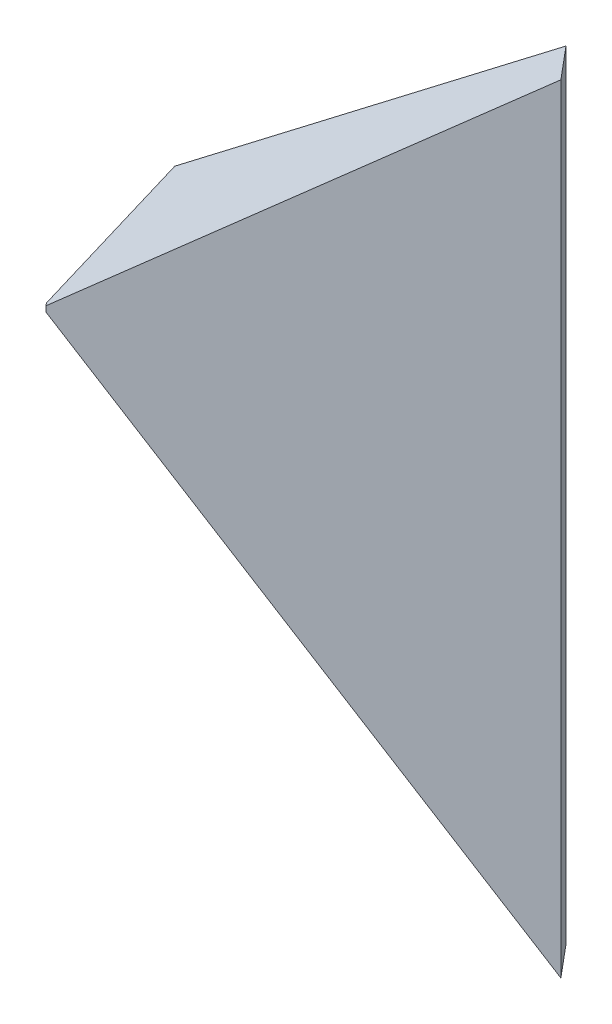
ISO-10303-21;
HEADER;
FILE_DESCRIPTION(('STEP AP214'),'2;1');
FILE_NAME('part.step','',(''),(''),'','','');
FILE_SCHEMA(('AUTOMOTIVE_DESIGN { 1 0 10303 214 1 1 1 1 }'));
ENDSEC;
DATA;
#1=APPLICATION_CONTEXT('core data for automotive mechanical design processes');
#2=APPLICATION_PROTOCOL_DEFINITION('international standard','automotive_design',2000,#1);
#3=PRODUCT_CONTEXT('',#1,'mechanical');
#4=PRODUCT('Part','Part','',(#3));
#5=PRODUCT_RELATED_PRODUCT_CATEGORY('part','',(#4));
#6=PRODUCT_DEFINITION_FORMATION('','',#4);
#7=PRODUCT_DEFINITION_CONTEXT('part definition',#1,'design');
#8=PRODUCT_DEFINITION('design','',#6,#7);
#9=PRODUCT_DEFINITION_SHAPE('','',#8);
#10=(LENGTH_UNIT() NAMED_UNIT(*) SI_UNIT(.MILLI.,.METRE.));
#11=(NAMED_UNIT(*) PLANE_ANGLE_UNIT() SI_UNIT($,.RADIAN.));
#12=(NAMED_UNIT(*) SI_UNIT($,.STERADIAN.) SOLID_ANGLE_UNIT());
#13=UNCERTAINTY_MEASURE_WITH_UNIT(LENGTH_MEASURE(1.E-05),#10,'distance_accuracy_value','');
#14=(GEOMETRIC_REPRESENTATION_CONTEXT(3) GLOBAL_UNCERTAINTY_ASSIGNED_CONTEXT((#13)) GLOBAL_UNIT_ASSIGNED_CONTEXT((#10,
#11,#12)) REPRESENTATION_CONTEXT('',''));
#15=CARTESIAN_POINT('',(0.,0.,0.));
#16=DIRECTION('',(0.,0.,1.));
#17=DIRECTION('',(1.,0.,0.));
#18=AXIS2_PLACEMENT_3D('',#15,#16,#17);
#19=CARTESIAN_POINT('',(771.95015379012,-11.5,93.959768373663));
#20=DIRECTION('',(0.147809411129979,0.,0.989015863361862));
#21=DIRECTION('',(0.,-1.,0.));
#22=AXIS2_PLACEMENT_3D('',#19,#20,#21);
#23=PLANE('',#22);
#24=DIRECTION('',(0.,1.,0.));
#25=VECTOR('',#24,1.);
#26=CARTESIAN_POINT('',(211.14845211481,-16.5,177.77214424733));
#27=LINE('',#26,#25);
#28=CARTESIAN_POINT('',(211.14845211481,-16.5,177.77214424733));
#29=VERTEX_POINT('',#28);
#30=CARTESIAN_POINT('',(211.14845211481,-6.5,177.77214424733));
#31=VERTEX_POINT('',#30);
#32=EDGE_CURVE('E10',#29,#31,#27,.T.);
#33=ORIENTED_EDGE('',*,*,#32,.F.);
#34=DIRECTION('',(0.752588687610631,-0.648814003967682,-0.112475132966945));
#35=VECTOR('',#34,1.);
#36=CARTESIAN_POINT('',(211.14845211481,-16.5,177.77214424733));
#37=LINE('',#36,#35);
#38=CARTESIAN_POINT('',(1017.310363989,-711.5,57.290439268188));
#39=VERTEX_POINT('',#38);
#40=EDGE_CURVE('E84',#29,#39,#37,.T.);
#41=ORIENTED_EDGE('',*,*,#40,.T.);
#42=DIRECTION('',(0.,-1.,0.));
#43=VECTOR('',#42,1.);
#44=CARTESIAN_POINT('',(1017.310363989,688.5,57.290439268188));
#45=LINE('',#44,#43);
#46=CARTESIAN_POINT('',(1017.310363989,688.5,57.290439268188));
#47=VERTEX_POINT('',#46);
#48=EDGE_CURVE('E26',#47,#39,#45,.T.);
#49=ORIENTED_EDGE('',*,*,#48,.F.);
#50=DIRECTION('',(-0.752588687610631,-0.648814003967682,0.112475132966945));
#51=VECTOR('',#50,1.);
#52=CARTESIAN_POINT('',(1017.310363989,688.5,57.290439268188));
#53=LINE('',#52,#51);
#54=EDGE_CURVE('E19',#47,#31,#53,.T.);
#55=ORIENTED_EDGE('',*,*,#54,.T.);
#56=EDGE_LOOP('',(#33,#41,#49,#55));
#57=FACE_BOUND('',#56,.T.);
#58=ADVANCED_FACE('F15',(#57),#23,.T.);
#59=CARTESIAN_POINT('',(209.1789483457,-11.5,175.42498105486));
#60=DIRECTION('',(-0.76604444311876,0.,0.642787609686799));
#61=DIRECTION('',(0.,1.,0.));
#62=AXIS2_PLACEMENT_3D('',#59,#60,#61);
#63=PLANE('',#62);
#64=DIRECTION('',(-0.642787609686799,0.,-0.76604444311876));
#65=VECTOR('',#64,1.);
#66=CARTESIAN_POINT('',(211.14845211481,-6.5,177.77214424733));
#67=LINE('',#66,#65);
#68=CARTESIAN_POINT('',(207.20944457659,-6.5,173.07781786239));
#69=VERTEX_POINT('',#68);
#70=EDGE_CURVE('E62',#31,#69,#67,.T.);
#71=ORIENTED_EDGE('',*,*,#70,.T.);
#72=DIRECTION('',(0.,-1.,0.));
#73=VECTOR('',#72,1.);
#74=CARTESIAN_POINT('',(207.20944457659,-6.5,173.07781786239));
#75=LINE('',#74,#73);
#76=CARTESIAN_POINT('',(207.20944457659,-16.5,173.07781786239));
#77=VERTEX_POINT('',#76);
#78=EDGE_CURVE('E77',#69,#77,#75,.T.);
#79=ORIENTED_EDGE('',*,*,#78,.T.);
#80=DIRECTION('',(0.642787609686799,0.,0.76604444311876));
#81=VECTOR('',#80,1.);
#82=CARTESIAN_POINT('',(207.20944457659,-16.5,173.07781786239));
#83=LINE('',#82,#81);
#84=EDGE_CURVE('E80',#77,#29,#83,.T.);
#85=ORIENTED_EDGE('',*,*,#84,.T.);
#86=ORIENTED_EDGE('',*,*,#32,.T.);
#87=EDGE_LOOP('',(#71,#79,#85,#86));
#88=FACE_BOUND('',#87,.T.);
#89=ADVANCED_FACE('F17',(#88),#63,.T.);
#90=CARTESIAN_POINT('',(741.57983631339,-11.5,-271.3124076772));
#91=DIRECTION('',(0.76604444311876,0.,-0.642787609686799));
#92=DIRECTION('',(0.,-1.,0.));
#93=AXIS2_PLACEMENT_3D('',#90,#91,#92);
#94=PLANE('',#93);
#95=DIRECTION('',(0.642787609686799,0.,0.76604444311876));
#96=VECTOR('',#95,1.);
#97=CARTESIAN_POINT('',(465.84930863764,688.5,-599.9152546227));
#98=LINE('',#97,#96);
#99=CARTESIAN_POINT('',(969.23797752921,688.5,0.));
#100=VERTEX_POINT('',#99);
#101=EDGE_CURVE('E116',#100,#47,#98,.T.);
#102=ORIENTED_EDGE('',*,*,#101,.T.);
#103=ORIENTED_EDGE('',*,*,#48,.T.);
#104=DIRECTION('',(-0.642787609686799,0.,-0.76604444311876));
#105=VECTOR('',#104,1.);
#106=CARTESIAN_POINT('',(1017.310363989,-711.5,57.290439268188));
#107=LINE('',#106,#105);
#108=CARTESIAN_POINT('',(969.23797752921,-711.5,0.));
#109=VERTEX_POINT('',#108);
#110=EDGE_CURVE('E96',#39,#109,#107,.T.);
#111=ORIENTED_EDGE('',*,*,#110,.T.);
#112=DIRECTION('',(0.,1.,0.));
#113=VECTOR('',#112,1.);
#114=CARTESIAN_POINT('',(969.23797752921,-630.75,0.));
#115=LINE('',#114,#113);
#116=EDGE_CURVE('E108',#109,#100,#115,.T.);
#117=ORIENTED_EDGE('',*,*,#116,.T.);
#118=EDGE_LOOP('',(#102,#103,#111,#117));
#119=FACE_BOUND('',#118,.T.);
#120=ADVANCED_FACE('F182',(#119),#94,.T.);
#121=CARTESIAN_POINT('',(550.80056683077,439.4553509639,-111.2295930181));
#122=DIRECTION('',(-0.54167522041975,0.707106781186674,0.45451947767179));
#123=DIRECTION('',(0.642787609686295,0.,0.766044443119183));
#124=AXIS2_PLACEMENT_3D('',#121,#122,#123);
#125=PLANE('',#124);
#126=ORIENTED_EDGE('',*,*,#70,.F.);
#127=ORIENTED_EDGE('',*,*,#54,.F.);
#128=ORIENTED_EDGE('',*,*,#101,.F.);
#129=DIRECTION('',(-0.793844806099446,-0.608120402411342,0.));
#130=VECTOR('',#129,1.);
#131=CARTESIAN_POINT('',(-279.6187289536,-268.179740253,0.));
#132=LINE('',#131,#130);
#133=CARTESIAN_POINT('',(265.12047234298,149.11469784928,0.));
#134=VERTEX_POINT('',#133);
#135=EDGE_CURVE('E119',#100,#134,#132,.T.);
#136=ORIENTED_EDGE('',*,*,#135,.T.);
#137=DIRECTION('',(0.241452037103851,0.648814003967599,-0.721624072515554));
#138=VECTOR('',#137,1.);
#139=CARTESIAN_POINT('',(207.20944457659,-6.5,173.07781786239));
#140=LINE('',#139,#138);
#141=EDGE_CURVE('E83',#69,#134,#140,.T.);
#142=ORIENTED_EDGE('',*,*,#141,.F.);
#143=EDGE_LOOP('',(#126,#127,#128,#136,#142));
#144=FACE_BOUND('',#143,.T.);
#145=ADVANCED_FACE('F189',(#144),#125,.T.);
#146=CARTESIAN_POINT('',(387.13071566378,-11.5,-364.6501795134));
#147=DIRECTION('',(-0.948323655206207,0.,-0.317304656405069));
#148=DIRECTION('',(-0.317304656405069,0.,0.948323655206207));
#149=AXIS2_PLACEMENT_3D('',#146,#147,#148);
#150=PLANE('',#149);
#151=ORIENTED_EDGE('',*,*,#78,.F.);
#152=ORIENTED_EDGE('',*,*,#141,.T.);
#153=DIRECTION('',(0.,-1.,0.));
#154=VECTOR('',#153,1.);
#155=CARTESIAN_POINT('',(265.12047234298,-630.75,0.));
#156=LINE('',#155,#154);
#157=CARTESIAN_POINT('',(265.12047234298,-172.1146978492,0.));
#158=VERTEX_POINT('',#157);
#159=EDGE_CURVE('E91',#134,#158,#156,.T.);
#160=ORIENTED_EDGE('',*,*,#159,.T.);
#161=DIRECTION('',(0.241452037103851,-0.648814003967599,-0.721624072515554));
#162=VECTOR('',#161,1.);
#163=CARTESIAN_POINT('',(207.20944457659,-16.5,173.07781786239));
#164=LINE('',#163,#162);
#165=EDGE_CURVE('E88',#77,#158,#164,.T.);
#166=ORIENTED_EDGE('',*,*,#165,.F.);
#167=EDGE_LOOP('',(#151,#152,#160,#166));
#168=FACE_BOUND('',#167,.T.);
#169=ADVANCED_FACE('F89',(#168),#150,.T.);
#170=CARTESIAN_POINT('',(550.80056683077,-462.4553509639,-111.2295930181));
#171=DIRECTION('',(-0.54167522041975,-0.707106781186674,0.45451947767179));
#172=DIRECTION('',(-0.793844806099472,0.608120402411309,0.));
#173=AXIS2_PLACEMENT_3D('',#170,#171,#172);
#174=PLANE('',#173);
#175=ORIENTED_EDGE('',*,*,#84,.F.);
#176=ORIENTED_EDGE('',*,*,#165,.T.);
#177=DIRECTION('',(0.793844806099446,-0.608120402411342,0.));
#178=VECTOR('',#177,1.);
#179=CARTESIAN_POINT('',(318.27113765427,-212.830469659,0.));
#180=LINE('',#179,#178);
#181=EDGE_CURVE('E102',#158,#109,#180,.T.);
#182=ORIENTED_EDGE('',*,*,#181,.T.);
#183=ORIENTED_EDGE('',*,*,#110,.F.);
#184=ORIENTED_EDGE('',*,*,#40,.F.);
#185=EDGE_LOOP('',(#175,#176,#182,#183,#184));
#186=FACE_BOUND('',#185,.T.);
#187=ADVANCED_FACE('F99',(#186),#174,.T.);
#188=CARTESIAN_POINT('',(-900.,-1250.,0.));
#189=DIRECTION('',(0.,0.,1.));
#190=DIRECTION('',(1.,0.,0.));
#191=AXIS2_PLACEMENT_3D('',#188,#189,#190);
#192=PLANE('',#191);
#193=ORIENTED_EDGE('',*,*,#159,.F.);
#194=ORIENTED_EDGE('',*,*,#135,.F.);
#195=ORIENTED_EDGE('',*,*,#116,.F.);
#196=ORIENTED_EDGE('',*,*,#181,.F.);
#197=EDGE_LOOP('',(#193,#194,#195,#196));
#198=FACE_BOUND('',#197,.T.);
#199=ADVANCED_FACE('F187',(#198),#192,.F.);
#200=CLOSED_SHELL('',(#58,#89,#120,#145,#169,#187,#199));
#201=MANIFOLD_SOLID_BREP('B1',#200);
#202=ADVANCED_BREP_SHAPE_REPRESENTATION('',(#18,#201),#14);
#203=SHAPE_DEFINITION_REPRESENTATION(#9,#202);
ENDSEC;
END-ISO-10303-21;
